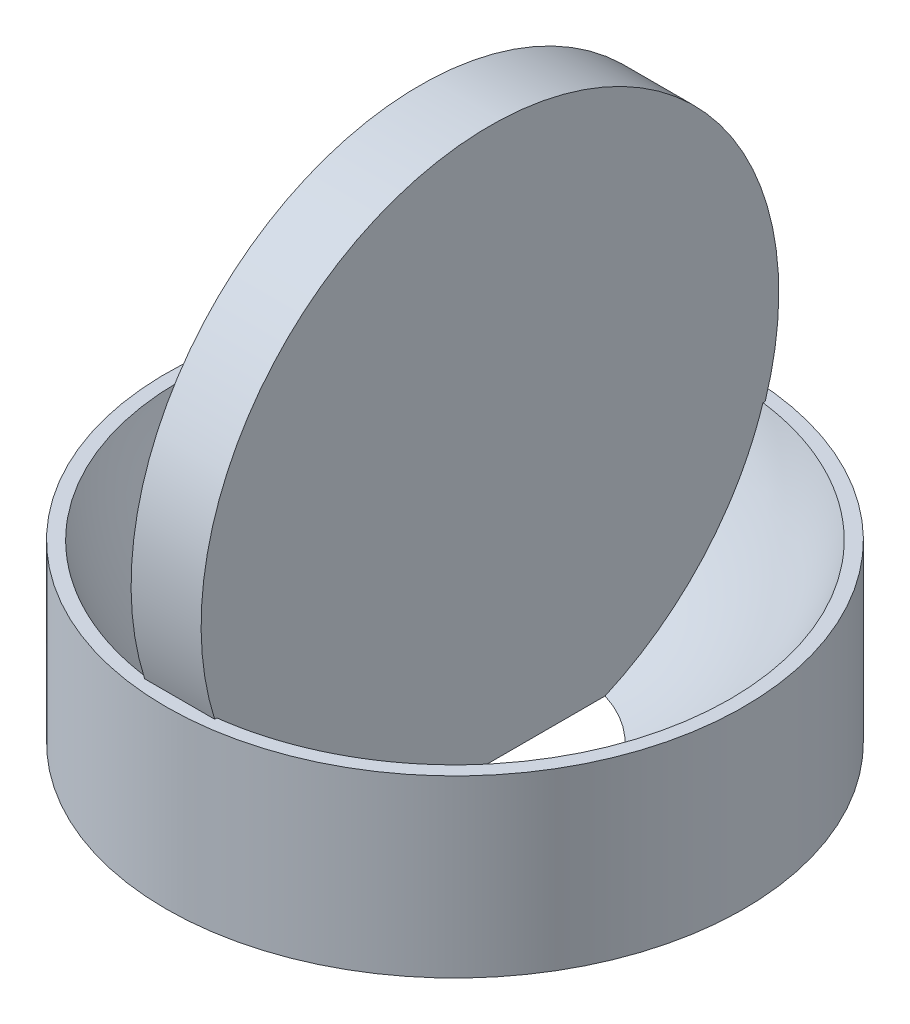
ISO-10303-21;
HEADER;
FILE_DESCRIPTION(('STEP AP214'),'2;1');
FILE_NAME('part.step','',(''),(''),'','','');
FILE_SCHEMA(('AUTOMOTIVE_DESIGN { 1 0 10303 214 1 1 1 1 }'));
ENDSEC;
DATA;
#1=APPLICATION_CONTEXT('core data for automotive mechanical design processes');
#2=APPLICATION_PROTOCOL_DEFINITION('international standard','automotive_design',2000,#1);
#3=PRODUCT_CONTEXT('',#1,'mechanical');
#4=PRODUCT('Part','Part','',(#3));
#5=PRODUCT_RELATED_PRODUCT_CATEGORY('part','',(#4));
#6=PRODUCT_DEFINITION_FORMATION('','',#4);
#7=PRODUCT_DEFINITION_CONTEXT('part definition',#1,'design');
#8=PRODUCT_DEFINITION('design','',#6,#7);
#9=PRODUCT_DEFINITION_SHAPE('','',#8);
#10=(LENGTH_UNIT() NAMED_UNIT(*) SI_UNIT(.MILLI.,.METRE.));
#11=(NAMED_UNIT(*) PLANE_ANGLE_UNIT() SI_UNIT($,.RADIAN.));
#12=(NAMED_UNIT(*) SI_UNIT($,.STERADIAN.) SOLID_ANGLE_UNIT());
#13=UNCERTAINTY_MEASURE_WITH_UNIT(LENGTH_MEASURE(1.E-05),#10,'distance_accuracy_value','');
#14=(GEOMETRIC_REPRESENTATION_CONTEXT(3) GLOBAL_UNCERTAINTY_ASSIGNED_CONTEXT((#13)) GLOBAL_UNIT_ASSIGNED_CONTEXT((#10,
#11,#12)) REPRESENTATION_CONTEXT('',''));
#15=CARTESIAN_POINT('',(0.,0.,0.));
#16=DIRECTION('',(0.,0.,1.));
#17=DIRECTION('',(1.,0.,0.));
#18=AXIS2_PLACEMENT_3D('',#15,#16,#17);
#19=CARTESIAN_POINT('',(1.,7.5,0.));
#20=DIRECTION('',(1.,0.,0.));
#21=DIRECTION('',(0.,0.,-1.));
#22=AXIS2_PLACEMENT_3D('',#19,#20,#21);
#23=PLANE('',#22);
#24=CARTESIAN_POINT('',(1.,7.5,0.));
#25=DIRECTION('',(1.,0.,0.));
#26=DIRECTION('',(0.,0.,-1.));
#27=AXIS2_PLACEMENT_3D('',#24,#25,#26);
#28=CIRCLE('',#27,8.1891696770796);
#29=CARTESIAN_POINT('',(1.,5.,7.79823698024111));
#30=VERTEX_POINT('',#29);
#31=CARTESIAN_POINT('',(1.,0.,3.28823660949148));
#32=VERTEX_POINT('',#31);
#33=EDGE_CURVE('E49',#30,#32,#28,.T.);
#34=ORIENTED_EDGE('',*,*,#33,.T.);
#35=DIRECTION('',(0.,0.,-1.));
#36=VECTOR('',#35,1.);
#37=CARTESIAN_POINT('',(1.,0.,0.));
#38=LINE('',#37,#36);
#39=CARTESIAN_POINT('',(1.,0.,-3.28823660949148));
#40=VERTEX_POINT('',#39);
#41=EDGE_CURVE('E127',#32,#40,#38,.T.);
#42=ORIENTED_EDGE('',*,*,#41,.T.);
#43=CARTESIAN_POINT('',(1.,5.,-7.79823698024111));
#44=VERTEX_POINT('',#43);
#45=EDGE_CURVE('E109',#40,#44,#28,.T.);
#46=ORIENTED_EDGE('',*,*,#45,.T.);
#47=DIRECTION('',(0.,0.,-1.));
#48=VECTOR('',#47,1.);
#49=CARTESIAN_POINT('',(1.,5.,0.));
#50=LINE('',#49,#48);
#51=CARTESIAN_POINT('',(1.,5.,-7.86209259675819));
#52=VERTEX_POINT('',#51);
#53=EDGE_CURVE('E142',#44,#52,#50,.T.);
#54=ORIENTED_EDGE('',*,*,#53,.T.);
#55=CARTESIAN_POINT('',(1.,7.5,0.));
#56=DIRECTION('',(1.,0.,0.));
#57=DIRECTION('',(0.,0.,-1.));
#58=AXIS2_PLACEMENT_3D('',#55,#56,#57);
#59=CIRCLE('',#58,8.25);
#60=CARTESIAN_POINT('',(1.,5.,7.86209259675819));
#61=VERTEX_POINT('',#60);
#62=EDGE_CURVE('E136',#52,#61,#59,.T.);
#63=ORIENTED_EDGE('',*,*,#62,.T.);
#64=EDGE_CURVE('E64',#61,#30,#50,.T.);
#65=ORIENTED_EDGE('',*,*,#64,.T.);
#66=EDGE_LOOP('',(#34,#42,#46,#54,#63,#65));
#67=FACE_BOUND('',#66,.T.);
#68=ADVANCED_FACE('F41',(#67),#23,.T.);
#69=CARTESIAN_POINT('',(-1.,7.5,0.));
#70=DIRECTION('',(1.,0.,0.));
#71=DIRECTION('',(0.,0.,-1.));
#72=AXIS2_PLACEMENT_3D('',#69,#70,#71);
#73=PLANE('',#72);
#74=DIRECTION('',(0.,0.,-1.));
#75=VECTOR('',#74,1.);
#76=CARTESIAN_POINT('',(-1.,0.,0.));
#77=LINE('',#76,#75);
#78=CARTESIAN_POINT('',(-1.,0.,3.28823660949148));
#79=VERTEX_POINT('',#78);
#80=CARTESIAN_POINT('',(-1.,0.,-3.28823660949148));
#81=VERTEX_POINT('',#80);
#82=EDGE_CURVE('E11',#79,#81,#77,.T.);
#83=ORIENTED_EDGE('',*,*,#82,.F.);
#84=CARTESIAN_POINT('',(-1.,7.5,0.));
#85=DIRECTION('',(1.,0.,0.));
#86=DIRECTION('',(0.,0.,-1.));
#87=AXIS2_PLACEMENT_3D('',#84,#85,#86);
#88=CIRCLE('',#87,8.1891696770796);
#89=CARTESIAN_POINT('',(-1.,5.,7.79823698024111));
#90=VERTEX_POINT('',#89);
#91=EDGE_CURVE('E97',#90,#79,#88,.T.);
#92=ORIENTED_EDGE('',*,*,#91,.F.);
#93=DIRECTION('',(0.,0.,-1.));
#94=VECTOR('',#93,1.);
#95=CARTESIAN_POINT('',(-1.,5.,0.));
#96=LINE('',#95,#94);
#97=CARTESIAN_POINT('',(-1.,5.,7.86209259675819));
#98=VERTEX_POINT('',#97);
#99=EDGE_CURVE('E141',#98,#90,#96,.T.);
#100=ORIENTED_EDGE('',*,*,#99,.F.);
#101=CARTESIAN_POINT('',(-1.,7.5,0.));
#102=DIRECTION('',(1.,0.,0.));
#103=DIRECTION('',(0.,0.,-1.));
#104=AXIS2_PLACEMENT_3D('',#101,#102,#103);
#105=CIRCLE('',#104,8.25);
#106=CARTESIAN_POINT('',(-1.,5.,-7.86209259675819));
#107=VERTEX_POINT('',#106);
#108=EDGE_CURVE('E133',#107,#98,#105,.T.);
#109=ORIENTED_EDGE('',*,*,#108,.F.);
#110=CARTESIAN_POINT('',(-1.,5.,-7.79823698024111));
#111=VERTEX_POINT('',#110);
#112=EDGE_CURVE('E56',#111,#107,#96,.T.);
#113=ORIENTED_EDGE('',*,*,#112,.F.);
#114=EDGE_CURVE('E99',#81,#111,#88,.T.);
#115=ORIENTED_EDGE('',*,*,#114,.F.);
#116=EDGE_LOOP('',(#83,#92,#100,#109,#113,#115));
#117=FACE_BOUND('',#116,.T.);
#118=ADVANCED_FACE('F95',(#117),#73,.F.);
#119=CARTESIAN_POINT('',(0.,5.,0.));
#120=DIRECTION('',(0.,1.,0.));
#121=DIRECTION('',(0.,0.,1.));
#122=AXIS2_PLACEMENT_3D('',#119,#120,#121);
#123=PLANE('',#122);
#124=ORIENTED_EDGE('',*,*,#64,.F.);
#125=DIRECTION('',(-1.,0.,0.));
#126=VECTOR('',#125,1.);
#127=CARTESIAN_POINT('',(1.,5.,7.86209259675819));
#128=LINE('',#127,#126);
#129=EDGE_CURVE('E145',#61,#98,#128,.T.);
#130=ORIENTED_EDGE('',*,*,#129,.T.);
#131=ORIENTED_EDGE('',*,*,#99,.T.);
#132=CARTESIAN_POINT('',(0.,5.,0.));
#133=DIRECTION('',(0.,1.,0.));
#134=DIRECTION('',(0.,0.,1.));
#135=AXIS2_PLACEMENT_3D('',#132,#133,#134);
#136=CIRCLE('',#135,7.86209259675819);
#137=EDGE_CURVE('E108',#90,#111,#136,.F.);
#138=ORIENTED_EDGE('',*,*,#137,.T.);
#139=ORIENTED_EDGE('',*,*,#112,.T.);
#140=DIRECTION('',(-1.,0.,0.));
#141=VECTOR('',#140,1.);
#142=CARTESIAN_POINT('',(1.,5.,-7.86209259675819));
#143=LINE('',#142,#141);
#144=EDGE_CURVE('E119',#107,#52,#143,.F.);
#145=ORIENTED_EDGE('',*,*,#144,.T.);
#146=ORIENTED_EDGE('',*,*,#53,.F.);
#147=EDGE_CURVE('E113',#44,#30,#136,.F.);
#148=ORIENTED_EDGE('',*,*,#147,.T.);
#149=EDGE_LOOP('',(#124,#130,#131,#138,#139,#145,#146,#148));
#150=FACE_BOUND('',#149,.T.);
#151=CARTESIAN_POINT('',(0.,5.,0.));
#152=DIRECTION('',(0.,1.,0.));
#153=DIRECTION('',(0.,0.,1.));
#154=AXIS2_PLACEMENT_3D('',#151,#152,#153);
#155=CIRCLE('',#154,8.25);
#156=CARTESIAN_POINT('',(0.,5.,8.25));
#157=VERTEX_POINT('',#156);
#158=EDGE_CURVE('E123',#157,#157,#155,.T.);
#159=ORIENTED_EDGE('',*,*,#158,.T.);
#160=EDGE_LOOP('',(#159));
#161=FACE_BOUND('',#160,.T.);
#162=ADVANCED_FACE('F153',(#150,#161),#123,.T.);
#163=CARTESIAN_POINT('',(0.,0.,0.));
#164=DIRECTION('',(0.,1.,0.));
#165=DIRECTION('',(0.,0.,1.));
#166=AXIS2_PLACEMENT_3D('',#163,#164,#165);
#167=PLANE('',#166);
#168=ORIENTED_EDGE('',*,*,#41,.F.);
#169=CARTESIAN_POINT('',(0.,0.,0.));
#170=DIRECTION('',(0.,1.,0.));
#171=DIRECTION('',(0.,0.,1.));
#172=AXIS2_PLACEMENT_3D('',#169,#170,#171);
#173=CIRCLE('',#172,3.43693177121688);
#174=EDGE_CURVE('E114',#40,#32,#173,.F.);
#175=ORIENTED_EDGE('',*,*,#174,.F.);
#176=EDGE_LOOP('',(#168,#175));
#177=FACE_BOUND('',#176,.T.);
#178=EDGE_CURVE('E106',#79,#81,#173,.F.);
#179=ORIENTED_EDGE('',*,*,#178,.F.);
#180=ORIENTED_EDGE('',*,*,#82,.T.);
#181=EDGE_LOOP('',(#179,#180));
#182=FACE_BOUND('',#181,.T.);
#183=CARTESIAN_POINT('',(0.,0.,0.));
#184=DIRECTION('',(0.,1.,0.));
#185=DIRECTION('',(0.,0.,1.));
#186=AXIS2_PLACEMENT_3D('',#183,#184,#185);
#187=CIRCLE('',#186,8.25);
#188=CARTESIAN_POINT('',(0.,0.,8.25));
#189=VERTEX_POINT('',#188);
#190=EDGE_CURVE('E121',#189,#189,#187,.T.);
#191=ORIENTED_EDGE('',*,*,#190,.F.);
#192=EDGE_LOOP('',(#191));
#193=FACE_BOUND('',#192,.T.);
#194=ADVANCED_FACE('F111',(#177,#182,#193),#167,.F.);
#195=CARTESIAN_POINT('',(0.,7.5,0.));
#196=DIRECTION('',(0.,0.,-1.));
#197=DIRECTION('',(1.,0.,0.));
#198=AXIS2_PLACEMENT_3D('',#195,#196,#197);
#199=SPHERICAL_SURFACE('',#198,8.25);
#200=ORIENTED_EDGE('',*,*,#137,.F.);
#201=ORIENTED_EDGE('',*,*,#91,.T.);
#202=ORIENTED_EDGE('',*,*,#178,.T.);
#203=ORIENTED_EDGE('',*,*,#114,.T.);
#204=EDGE_LOOP('',(#200,#201,#202,#203));
#205=FACE_BOUND('',#204,.T.);
#206=ADVANCED_FACE('F105',(#205),#199,.F.);
#207=CARTESIAN_POINT('',(0.,5.,0.));
#208=DIRECTION('',(0.,-1.,0.));
#209=DIRECTION('',(0.,0.,-1.));
#210=AXIS2_PLACEMENT_3D('',#207,#208,#209);
#211=CYLINDRICAL_SURFACE('',#210,8.25);
#212=ORIENTED_EDGE('',*,*,#158,.F.);
#213=EDGE_LOOP('',(#212));
#214=FACE_BOUND('',#213,.T.);
#215=ORIENTED_EDGE('',*,*,#190,.T.);
#216=EDGE_LOOP('',(#215));
#217=FACE_BOUND('',#216,.T.);
#218=ADVANCED_FACE('F43',(#214,#217),#211,.T.);
#219=ORIENTED_EDGE('',*,*,#33,.F.);
#220=ORIENTED_EDGE('',*,*,#147,.F.);
#221=ORIENTED_EDGE('',*,*,#45,.F.);
#222=ORIENTED_EDGE('',*,*,#174,.T.);
#223=EDGE_LOOP('',(#219,#220,#221,#222));
#224=FACE_BOUND('',#223,.T.);
#225=ADVANCED_FACE('F131',(#224),#199,.F.);
#226=CARTESIAN_POINT('',(1.,7.5,0.));
#227=DIRECTION('',(-1.,0.,0.));
#228=DIRECTION('',(0.,0.,1.));
#229=AXIS2_PLACEMENT_3D('',#226,#227,#228);
#230=CYLINDRICAL_SURFACE('',#229,8.25);
#231=ORIENTED_EDGE('',*,*,#144,.F.);
#232=ORIENTED_EDGE('',*,*,#108,.T.);
#233=ORIENTED_EDGE('',*,*,#129,.F.);
#234=ORIENTED_EDGE('',*,*,#62,.F.);
#235=EDGE_LOOP('',(#231,#232,#233,#234));
#236=FACE_BOUND('',#235,.T.);
#237=ADVANCED_FACE('F155',(#236),#230,.T.);
#238=CLOSED_SHELL('',(#68,#118,#162,#194,#206,#218,#225,#237));
#239=MANIFOLD_SOLID_BREP('B2',#238);
#240=ADVANCED_BREP_SHAPE_REPRESENTATION('',(#18,#239),#14);
#241=SHAPE_DEFINITION_REPRESENTATION(#9,#240);
ENDSEC;
END-ISO-10303-21;
